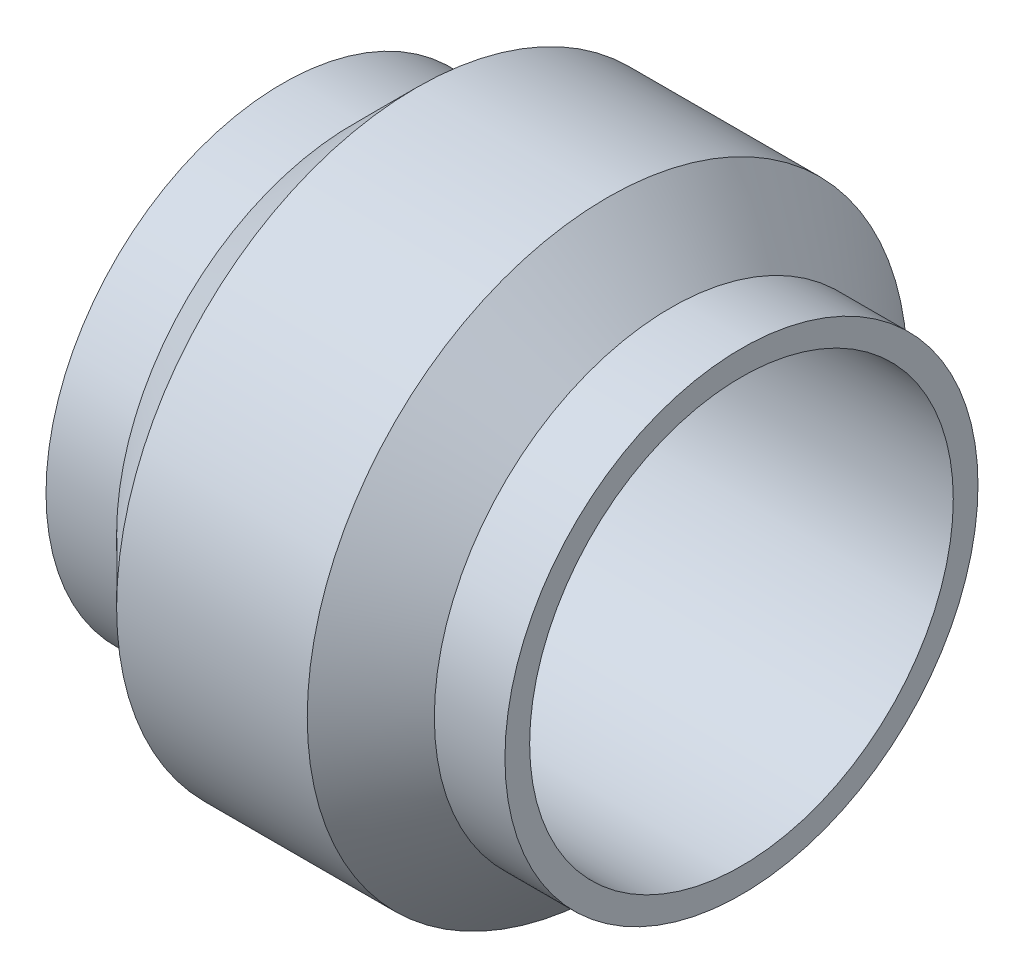
ISO-10303-21;
HEADER;
FILE_DESCRIPTION(('STEP AP214'),'2;1');
FILE_NAME('part.step','',(''),(''),'','','');
FILE_SCHEMA(('AUTOMOTIVE_DESIGN { 1 0 10303 214 1 1 1 1 }'));
ENDSEC;
DATA;
#1=APPLICATION_CONTEXT('core data for automotive mechanical design processes');
#2=APPLICATION_PROTOCOL_DEFINITION('international standard','automotive_design',2000,#1);
#3=PRODUCT_CONTEXT('',#1,'mechanical');
#4=PRODUCT('Part','Part','',(#3));
#5=PRODUCT_RELATED_PRODUCT_CATEGORY('part','',(#4));
#6=PRODUCT_DEFINITION_FORMATION('','',#4);
#7=PRODUCT_DEFINITION_CONTEXT('part definition',#1,'design');
#8=PRODUCT_DEFINITION('design','',#6,#7);
#9=PRODUCT_DEFINITION_SHAPE('','',#8);
#10=(LENGTH_UNIT() NAMED_UNIT(*) SI_UNIT(.MILLI.,.METRE.));
#11=(NAMED_UNIT(*) PLANE_ANGLE_UNIT() SI_UNIT($,.RADIAN.));
#12=(NAMED_UNIT(*) SI_UNIT($,.STERADIAN.) SOLID_ANGLE_UNIT());
#13=UNCERTAINTY_MEASURE_WITH_UNIT(LENGTH_MEASURE(1.E-05),#10,'distance_accuracy_value','');
#14=(GEOMETRIC_REPRESENTATION_CONTEXT(3) GLOBAL_UNCERTAINTY_ASSIGNED_CONTEXT((#13)) GLOBAL_UNIT_ASSIGNED_CONTEXT((#10,
#11,#12)) REPRESENTATION_CONTEXT('',''));
#15=CARTESIAN_POINT('',(0.,0.,0.));
#16=DIRECTION('',(0.,0.,1.));
#17=DIRECTION('',(1.,0.,0.));
#18=AXIS2_PLACEMENT_3D('',#15,#16,#17);
#19=CARTESIAN_POINT('',(15.59086975579,0.,0.));
#20=DIRECTION('',(-1.,0.,0.));
#21=DIRECTION('',(0.,0.,1.));
#22=AXIS2_PLACEMENT_3D('',#19,#20,#21);
#23=CYLINDRICAL_SURFACE('',#22,4.25);
#24=CARTESIAN_POINT('',(20.5158697557977,0.,0.));
#25=DIRECTION('',(-1.,0.,0.));
#26=DIRECTION('',(0.,1.,0.));
#27=AXIS2_PLACEMENT_3D('',#24,#25,#26);
#28=CIRCLE('',#27,4.24999999995634);
#29=CARTESIAN_POINT('',(20.5158697557977,4.24999999995634,0.));
#30=VERTEX_POINT('',#29);
#31=EDGE_CURVE('E45',#30,#30,#28,.F.);
#32=ORIENTED_EDGE('',*,*,#31,.F.);
#33=EDGE_LOOP('',(#32));
#34=FACE_BOUND('',#33,.T.);
#35=CARTESIAN_POINT('',(17.8158697558501,0.,0.));
#36=DIRECTION('',(1.,0.,0.));
#37=DIRECTION('',(0.,-1.,0.));
#38=AXIS2_PLACEMENT_3D('',#35,#36,#37);
#39=CIRCLE('',#38,4.25000000001319);
#40=CARTESIAN_POINT('',(17.8158697558501,-4.25000000001319,0.));
#41=VERTEX_POINT('',#40);
#42=EDGE_CURVE('E30',#41,#41,#39,.F.);
#43=ORIENTED_EDGE('',*,*,#42,.F.);
#44=EDGE_LOOP('',(#43));
#45=FACE_BOUND('',#44,.T.);
#46=ADVANCED_FACE('F15',(#34,#45),#23,.T.);
#47=CARTESIAN_POINT('',(17.8158697557365,0.,0.));
#48=DIRECTION('',(1.,0.,0.));
#49=DIRECTION('',(0.,0.,-1.));
#50=AXIS2_PLACEMENT_3D('',#47,#48,#49);
#51=CONICAL_SURFACE('',#50,4.2499999998995,0.785398163397448);
#52=CARTESIAN_POINT('',(16.91586975579,0.,0.));
#53=DIRECTION('',(-1.,0.,0.));
#54=DIRECTION('',(0.,0.,1.));
#55=AXIS2_PLACEMENT_3D('',#52,#53,#54);
#56=CIRCLE('',#55,3.35);
#57=CARTESIAN_POINT('',(16.91586975579,0.,3.35));
#58=VERTEX_POINT('',#57);
#59=EDGE_CURVE('E40',#58,#58,#56,.T.);
#60=ORIENTED_EDGE('',*,*,#59,.F.);
#61=EDGE_LOOP('',(#60));
#62=FACE_BOUND('',#61,.T.);
#63=ORIENTED_EDGE('',*,*,#42,.T.);
#64=EDGE_LOOP('',(#63));
#65=FACE_BOUND('',#64,.T.);
#66=ADVANCED_FACE('F53',(#62,#65),#51,.T.);
#67=CARTESIAN_POINT('',(20.5158697558545,0.,0.));
#68=DIRECTION('',(-1.,0.,0.));
#69=DIRECTION('',(0.,0.,1.));
#70=AXIS2_PLACEMENT_3D('',#67,#68,#69);
#71=CONICAL_SURFACE('',#70,4.2499999998995,0.785398163397448);
#72=ORIENTED_EDGE('',*,*,#31,.T.);
#73=EDGE_LOOP('',(#72));
#74=FACE_BOUND('',#73,.T.);
#75=CARTESIAN_POINT('',(21.41586975579,0.,0.));
#76=DIRECTION('',(-1.,0.,0.));
#77=DIRECTION('',(0.,0.,1.));
#78=AXIS2_PLACEMENT_3D('',#75,#76,#77);
#79=CIRCLE('',#78,3.35);
#80=CARTESIAN_POINT('',(21.41586975579,0.,3.35));
#81=VERTEX_POINT('',#80);
#82=EDGE_CURVE('E36',#81,#81,#79,.F.);
#83=ORIENTED_EDGE('',*,*,#82,.F.);
#84=EDGE_LOOP('',(#83));
#85=FACE_BOUND('',#84,.T.);
#86=ADVANCED_FACE('F61',(#74,#85),#71,.T.);
#87=CARTESIAN_POINT('',(15.59086975579,0.,0.));
#88=DIRECTION('',(-1.,0.,0.));
#89=DIRECTION('',(0.,0.,1.));
#90=AXIS2_PLACEMENT_3D('',#87,#88,#89);
#91=CYLINDRICAL_SURFACE('',#90,3.35);
#92=CARTESIAN_POINT('',(15.91586975579,0.,0.));
#93=DIRECTION('',(-1.,0.,0.));
#94=DIRECTION('',(0.,0.,1.));
#95=AXIS2_PLACEMENT_3D('',#92,#93,#94);
#96=CIRCLE('',#95,3.35);
#97=CARTESIAN_POINT('',(15.91586975579,0.,3.35));
#98=VERTEX_POINT('',#97);
#99=EDGE_CURVE('E18',#98,#98,#96,.F.);
#100=ORIENTED_EDGE('',*,*,#99,.T.);
#101=EDGE_LOOP('',(#100));
#102=FACE_BOUND('',#101,.T.);
#103=ORIENTED_EDGE('',*,*,#59,.T.);
#104=EDGE_LOOP('',(#103));
#105=FACE_BOUND('',#104,.T.);
#106=ADVANCED_FACE('F81',(#102,#105),#91,.T.);
#107=CARTESIAN_POINT('',(15.59086975579,0.,0.));
#108=DIRECTION('',(-1.,0.,0.));
#109=DIRECTION('',(0.,0.,1.));
#110=AXIS2_PLACEMENT_3D('',#107,#108,#109);
#111=CYLINDRICAL_SURFACE('',#110,3.35);
#112=CARTESIAN_POINT('',(22.41586975579,0.,0.));
#113=DIRECTION('',(-1.,0.,0.));
#114=DIRECTION('',(0.,0.,1.));
#115=AXIS2_PLACEMENT_3D('',#112,#113,#114);
#116=CIRCLE('',#115,3.35);
#117=CARTESIAN_POINT('',(22.41586975579,0.,3.35));
#118=VERTEX_POINT('',#117);
#119=EDGE_CURVE('E27',#118,#118,#116,.F.);
#120=ORIENTED_EDGE('',*,*,#119,.F.);
#121=EDGE_LOOP('',(#120));
#122=FACE_BOUND('',#121,.T.);
#123=ORIENTED_EDGE('',*,*,#82,.T.);
#124=EDGE_LOOP('',(#123));
#125=FACE_BOUND('',#124,.T.);
#126=ADVANCED_FACE('F77',(#122,#125),#111,.T.);
#127=CARTESIAN_POINT('',(15.91586975579,0.,0.));
#128=DIRECTION('',(1.,0.,0.));
#129=DIRECTION('',(0.,0.,-1.));
#130=AXIS2_PLACEMENT_3D('',#127,#128,#129);
#131=PLANE('',#130);
#132=CARTESIAN_POINT('',(15.91586975579,0.,0.));
#133=DIRECTION('',(-1.,0.,0.));
#134=DIRECTION('',(0.,0.,1.));
#135=AXIS2_PLACEMENT_3D('',#132,#133,#134);
#136=CIRCLE('',#135,3.);
#137=CARTESIAN_POINT('',(15.91586975579,0.,3.));
#138=VERTEX_POINT('',#137);
#139=EDGE_CURVE('E22',#138,#138,#136,.F.);
#140=ORIENTED_EDGE('',*,*,#139,.T.);
#141=EDGE_LOOP('',(#140));
#142=FACE_BOUND('',#141,.T.);
#143=ORIENTED_EDGE('',*,*,#99,.F.);
#144=EDGE_LOOP('',(#143));
#145=FACE_BOUND('',#144,.T.);
#146=ADVANCED_FACE('F71',(#142,#145),#131,.F.);
#147=CARTESIAN_POINT('',(22.41586975579,0.,0.));
#148=DIRECTION('',(1.,0.,0.));
#149=DIRECTION('',(0.,0.,-1.));
#150=AXIS2_PLACEMENT_3D('',#147,#148,#149);
#151=PLANE('',#150);
#152=CARTESIAN_POINT('',(22.41586975579,0.,0.));
#153=DIRECTION('',(-1.,0.,0.));
#154=DIRECTION('',(0.,0.,1.));
#155=AXIS2_PLACEMENT_3D('',#152,#153,#154);
#156=CIRCLE('',#155,3.);
#157=CARTESIAN_POINT('',(22.41586975579,0.,3.));
#158=VERTEX_POINT('',#157);
#159=EDGE_CURVE('E10',#158,#158,#156,.T.);
#160=ORIENTED_EDGE('',*,*,#159,.T.);
#161=EDGE_LOOP('',(#160));
#162=FACE_BOUND('',#161,.T.);
#163=ORIENTED_EDGE('',*,*,#119,.T.);
#164=EDGE_LOOP('',(#163));
#165=FACE_BOUND('',#164,.T.);
#166=ADVANCED_FACE('F65',(#162,#165),#151,.T.);
#167=CARTESIAN_POINT('',(15.59086975579,0.,0.));
#168=DIRECTION('',(-1.,0.,0.));
#169=DIRECTION('',(0.,0.,1.));
#170=AXIS2_PLACEMENT_3D('',#167,#168,#169);
#171=CYLINDRICAL_SURFACE('',#170,3.);
#172=ORIENTED_EDGE('',*,*,#159,.F.);
#173=EDGE_LOOP('',(#172));
#174=FACE_BOUND('',#173,.T.);
#175=ORIENTED_EDGE('',*,*,#139,.F.);
#176=EDGE_LOOP('',(#175));
#177=FACE_BOUND('',#176,.T.);
#178=ADVANCED_FACE('F63',(#174,#177),#171,.F.);
#179=CLOSED_SHELL('',(#46,#66,#86,#106,#126,#146,#166,#178));
#180=MANIFOLD_SOLID_BREP('B1',#179);
#181=ADVANCED_BREP_SHAPE_REPRESENTATION('',(#18,#180),#14);
#182=SHAPE_DEFINITION_REPRESENTATION(#9,#181);
ENDSEC;
END-ISO-10303-21;
